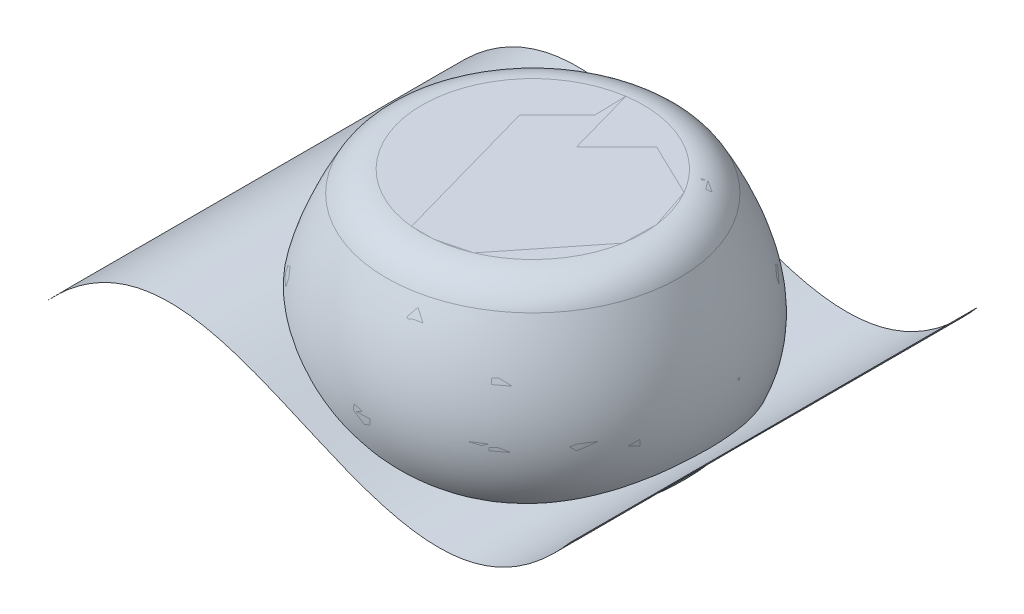
ISO-10303-21;
HEADER;
FILE_DESCRIPTION(('STEP AP214'),'2;1');
FILE_NAME('part.step','',(''),(''),'','','');
FILE_SCHEMA(('AUTOMOTIVE_DESIGN { 1 0 10303 214 1 1 1 1 }'));
ENDSEC;
DATA;
#1=APPLICATION_CONTEXT('core data for automotive mechanical design processes');
#2=APPLICATION_PROTOCOL_DEFINITION('international standard','automotive_design',2000,#1);
#3=PRODUCT_CONTEXT('',#1,'mechanical');
#4=PRODUCT('Part','Part','',(#3));
#5=PRODUCT_RELATED_PRODUCT_CATEGORY('part','',(#4));
#6=PRODUCT_DEFINITION_FORMATION('','',#4);
#7=PRODUCT_DEFINITION_CONTEXT('part definition',#1,'design');
#8=PRODUCT_DEFINITION('design','',#6,#7);
#9=PRODUCT_DEFINITION_SHAPE('','',#8);
#10=(LENGTH_UNIT() NAMED_UNIT(*) SI_UNIT(.MILLI.,.METRE.));
#11=(NAMED_UNIT(*) PLANE_ANGLE_UNIT() SI_UNIT($,.RADIAN.));
#12=(NAMED_UNIT(*) SI_UNIT($,.STERADIAN.) SOLID_ANGLE_UNIT());
#13=UNCERTAINTY_MEASURE_WITH_UNIT(LENGTH_MEASURE(1.E-05),#10,'distance_accuracy_value','');
#14=(GEOMETRIC_REPRESENTATION_CONTEXT(3) GLOBAL_UNCERTAINTY_ASSIGNED_CONTEXT((#13)) GLOBAL_UNIT_ASSIGNED_CONTEXT((#10,
#11,#12)) REPRESENTATION_CONTEXT('',''));
#15=CARTESIAN_POINT('',(0.,0.,0.));
#16=DIRECTION('',(0.,0.,1.));
#17=DIRECTION('',(1.,0.,0.));
#18=AXIS2_PLACEMENT_3D('',#15,#16,#17);
#19=CARTESIAN_POINT('',(-69.277469966941,-6.47148377102412,0.));
#20=CARTESIAN_POINT('',(-25.1471690410937,41.2236250733039,0.));
#21=CARTESIAN_POINT('',(14.801469396763,-45.1132709065495,0.));
#22=CARTESIAN_POINT('',(59.0827921122741,6.50356077127922,0.));
#23=B_SPLINE_CURVE_WITH_KNOTS('',3,(#19,#20,#21,#22),.UNSPECIFIED.,.F.,.F.,(4,4),(0.,1.),.UNSPECIFIED.);
#24=DIRECTION('',(0.,0.,1.));
#25=VECTOR('',#24,1.);
#26=SURFACE_OF_LINEAR_EXTRUSION('',#23,#25);
#27=CARTESIAN_POINT('',(-69.277469966941,-6.47148377102412,50.));
#28=CARTESIAN_POINT('',(-25.1471690410937,41.2236250733039,50.));
#29=CARTESIAN_POINT('',(14.801469396763,-45.1132709065495,50.));
#30=CARTESIAN_POINT('',(59.0827921122741,6.50356077127922,50.));
#31=B_SPLINE_CURVE_WITH_KNOTS('',3,(#27,#28,#29,#30),.UNSPECIFIED.,.F.,.F.,(4,4),(0.,1.),.UNSPECIFIED.);
#32=CARTESIAN_POINT('',(-69.277469966941,-6.47148377102412,50.));
#33=VERTEX_POINT('',#32);
#34=CARTESIAN_POINT('',(59.0827921122741,6.50356077127922,50.));
#35=VERTEX_POINT('',#34);
#36=EDGE_CURVE('E62',#33,#35,#31,.T.);
#37=ORIENTED_EDGE('',*,*,#36,.F.);
#38=DIRECTION('',(0.,0.,1.));
#39=VECTOR('',#38,1.);
#40=CARTESIAN_POINT('',(-69.277469966941,-6.47148377102412,0.));
#41=LINE('',#40,#39);
#42=CARTESIAN_POINT('',(-69.277469966941,-6.47148377102412,-50.));
#43=VERTEX_POINT('',#42);
#44=EDGE_CURVE('E54',#43,#33,#41,.T.);
#45=ORIENTED_EDGE('',*,*,#44,.F.);
#46=CARTESIAN_POINT('',(-69.277469966941,-6.47148377102412,-50.));
#47=CARTESIAN_POINT('',(-25.1471690410937,41.2236250733039,-50.));
#48=CARTESIAN_POINT('',(14.801469396763,-45.1132709065495,-50.));
#49=CARTESIAN_POINT('',(59.0827921122741,6.50356077127922,-50.));
#50=B_SPLINE_CURVE_WITH_KNOTS('',3,(#46,#47,#48,#49),.UNSPECIFIED.,.F.,.F.,(4,4),(0.,1.),.UNSPECIFIED.);
#51=CARTESIAN_POINT('',(59.0827921122741,6.50356077127922,-50.));
#52=VERTEX_POINT('',#51);
#53=EDGE_CURVE('E72',#43,#52,#50,.T.);
#54=ORIENTED_EDGE('',*,*,#53,.T.);
#55=DIRECTION('',(0.,0.,1.));
#56=VECTOR('',#55,1.);
#57=CARTESIAN_POINT('',(59.0827921122741,6.50356077127922,0.));
#58=LINE('',#57,#56);
#59=EDGE_CURVE('E12',#52,#35,#58,.T.);
#60=ORIENTED_EDGE('',*,*,#59,.T.);
#61=EDGE_LOOP('',(#37,#45,#54,#60));
#62=FACE_BOUND('',#61,.T.);
#63=ADVANCED_FACE('F52',(#62),#26,.T.);
#64=OPEN_SHELL('',(#63));
#65=SHELL_BASED_SURFACE_MODEL('B2',(#64));
#66=CARTESIAN_POINT('',(-32.8601568198395,31.2442607099683,0.));
#67=CARTESIAN_POINT('',(-66.0245526526524,-21.9410159608166,0.));
#68=CARTESIAN_POINT('',(0.,-29.9764651818748,0.));
#69=B_SPLINE_CURVE_WITH_KNOTS('',2,(#66,#67,#68),.UNSPECIFIED.,.F.,.F.,(3,3),(0.,1.),.UNSPECIFIED.);
#70=CARTESIAN_POINT('',(0.,-36.5448515190839,0.));
#71=DIRECTION('',(0.,1.,0.));
#72=AXIS1_PLACEMENT('',#70,#71);
#73=SURFACE_OF_REVOLUTION('',#69,#72);
#74=CARTESIAN_POINT('',(0.,26.0944386957487,0.));
#75=DIRECTION('',(0.,1.,0.));
#76=DIRECTION('',(0.,0.,1.));
#77=AXIS2_PLACEMENT_3D('',#74,#75,#76);
#78=CIRCLE('',#77,35.897681248424);
#79=CARTESIAN_POINT('',(0.,26.0944386957487,35.897681248424));
#80=VERTEX_POINT('',#79);
#81=EDGE_CURVE('E128',#80,#80,#78,.F.);
#82=ORIENTED_EDGE('',*,*,#81,.T.);
#83=EDGE_LOOP('',(#82));
#84=FACE_BOUND('',#83,.T.);
#85=CARTESIAN_POINT('',(0.,-29.9764651818748,0.));
#86=VERTEX_POINT('',#85);
#87=VERTEX_LOOP('',#86);
#88=FACE_BOUND('',#87,.T.);
#89=ADVANCED_FACE('F121',(#84,#88),#73,.F.);
#90=CARTESIAN_POINT('',(0.,21.2442607099683,0.));
#91=DIRECTION('',(0.,1.,0.));
#92=DIRECTION('',(0.,0.,1.));
#93=AXIS2_PLACEMENT_3D('',#90,#91,#92);
#94=TOROIDAL_SURFACE('',#93,27.1526384522879,10.);
#95=ORIENTED_EDGE('',*,*,#81,.F.);
#96=EDGE_LOOP('',(#95));
#97=FACE_BOUND('',#96,.T.);
#98=CARTESIAN_POINT('',(0.,31.2442607099683,0.));
#99=DIRECTION('',(0.,1.,0.));
#100=DIRECTION('',(0.,0.,1.));
#101=AXIS2_PLACEMENT_3D('',#98,#99,#100);
#102=CIRCLE('',#101,27.1526384522879);
#103=CARTESIAN_POINT('',(0.,31.2442607099683,27.1526384522879));
#104=VERTEX_POINT('',#103);
#105=EDGE_CURVE('E50',#104,#104,#102,.T.);
#106=ORIENTED_EDGE('',*,*,#105,.F.);
#107=EDGE_LOOP('',(#106));
#108=FACE_BOUND('',#107,.T.);
#109=ADVANCED_FACE('F132',(#97,#108),#94,.T.);
#110=CARTESIAN_POINT('',(0.,31.2442607099683,0.));
#111=DIRECTION('',(0.,1.,0.));
#112=DIRECTION('',(0.,0.,1.));
#113=AXIS2_PLACEMENT_3D('',#110,#111,#112);
#114=PLANE('',#113);
#115=ORIENTED_EDGE('',*,*,#105,.T.);
#116=EDGE_LOOP('',(#115));
#117=FACE_BOUND('',#116,.T.);
#118=ADVANCED_FACE('F123',(#117),#114,.T.);
#119=CLOSED_SHELL('',(#89,#109,#118));
#120=MANIFOLD_SOLID_BREP('B6',#119);
#121=CARTESIAN_POINT('',(-32.8601568198395,31.2442607099683,0.));
#122=CARTESIAN_POINT('',(-66.0245526526524,-21.9410159608166,0.));
#123=CARTESIAN_POINT('',(0.,-29.9764651818748,0.));
#124=B_SPLINE_CURVE_WITH_KNOTS('',2,(#121,#122,#123),.UNSPECIFIED.,.F.,.F.,(3,3),(0.,1.),.UNSPECIFIED.);
#125=CARTESIAN_POINT('',(0.,-36.5448515190839,0.));
#126=DIRECTION('',(0.,1.,0.));
#127=AXIS1_PLACEMENT('',#125,#126);
#128=SURFACE_OF_REVOLUTION('',#124,#127);
#129=CARTESIAN_POINT('',(0.,26.0944386957487,0.));
#130=DIRECTION('',(0.,1.,0.));
#131=DIRECTION('',(0.,0.,1.));
#132=AXIS2_PLACEMENT_3D('',#129,#130,#131);
#133=CIRCLE('',#132,35.897681248424);
#134=CARTESIAN_POINT('',(0.,26.0944386957487,35.897681248424));
#135=VERTEX_POINT('',#134);
#136=EDGE_CURVE('E119',#135,#135,#133,.F.);
#137=ORIENTED_EDGE('',*,*,#136,.T.);
#138=EDGE_LOOP('',(#137));
#139=FACE_BOUND('',#138,.T.);
#140=CARTESIAN_POINT('',(0.,-29.9764651818748,0.));
#141=VERTEX_POINT('',#140);
#142=VERTEX_LOOP('',#141);
#143=FACE_BOUND('',#142,.T.);
#144=ADVANCED_FACE('F170',(#139,#143),#128,.F.);
#145=CARTESIAN_POINT('',(0.,31.2442607099683,0.));
#146=DIRECTION('',(0.,1.,0.));
#147=DIRECTION('',(0.,0.,1.));
#148=AXIS2_PLACEMENT_3D('',#145,#146,#147);
#149=PLANE('',#148);
#150=CARTESIAN_POINT('',(0.,31.2442607099683,0.));
#151=DIRECTION('',(0.,1.,0.));
#152=DIRECTION('',(0.,0.,1.));
#153=AXIS2_PLACEMENT_3D('',#150,#151,#152);
#154=CIRCLE('',#153,27.1526384522879);
#155=CARTESIAN_POINT('',(0.,31.2442607099683,27.1526384522879));
#156=VERTEX_POINT('',#155);
#157=EDGE_CURVE('E177',#156,#156,#154,.T.);
#158=ORIENTED_EDGE('',*,*,#157,.T.);
#159=EDGE_LOOP('',(#158));
#160=FACE_BOUND('',#159,.T.);
#161=ADVANCED_FACE('F181',(#160),#149,.T.);
#162=CARTESIAN_POINT('',(0.,21.2442607099683,0.));
#163=DIRECTION('',(0.,1.,0.));
#164=DIRECTION('',(0.,0.,1.));
#165=AXIS2_PLACEMENT_3D('',#162,#163,#164);
#166=TOROIDAL_SURFACE('',#165,27.1526384522879,10.);
#167=ORIENTED_EDGE('',*,*,#136,.F.);
#168=EDGE_LOOP('',(#167));
#169=FACE_BOUND('',#168,.T.);
#170=ORIENTED_EDGE('',*,*,#157,.F.);
#171=EDGE_LOOP('',(#170));
#172=FACE_BOUND('',#171,.T.);
#173=ADVANCED_FACE('F172',(#169,#172),#166,.T.);
#174=OPEN_SHELL('',(#144,#161,#173));
#175=SHELL_BASED_SURFACE_MODEL('B44',(#174));
#176=ADVANCED_BREP_SHAPE_REPRESENTATION('',(#18,#120),#14);
#177=MANIFOLD_SURFACE_SHAPE_REPRESENTATION('',(#18,#65,#175),#14);
#178=SHAPE_REPRESENTATION('',(#18),#14);
#179=SHAPE_DEFINITION_REPRESENTATION(#9,#178);
#180=SHAPE_REPRESENTATION_RELATIONSHIP('','',#178,#176);
#181=SHAPE_REPRESENTATION_RELATIONSHIP('','',#178,#177);
ENDSEC;
END-ISO-10303-21;
